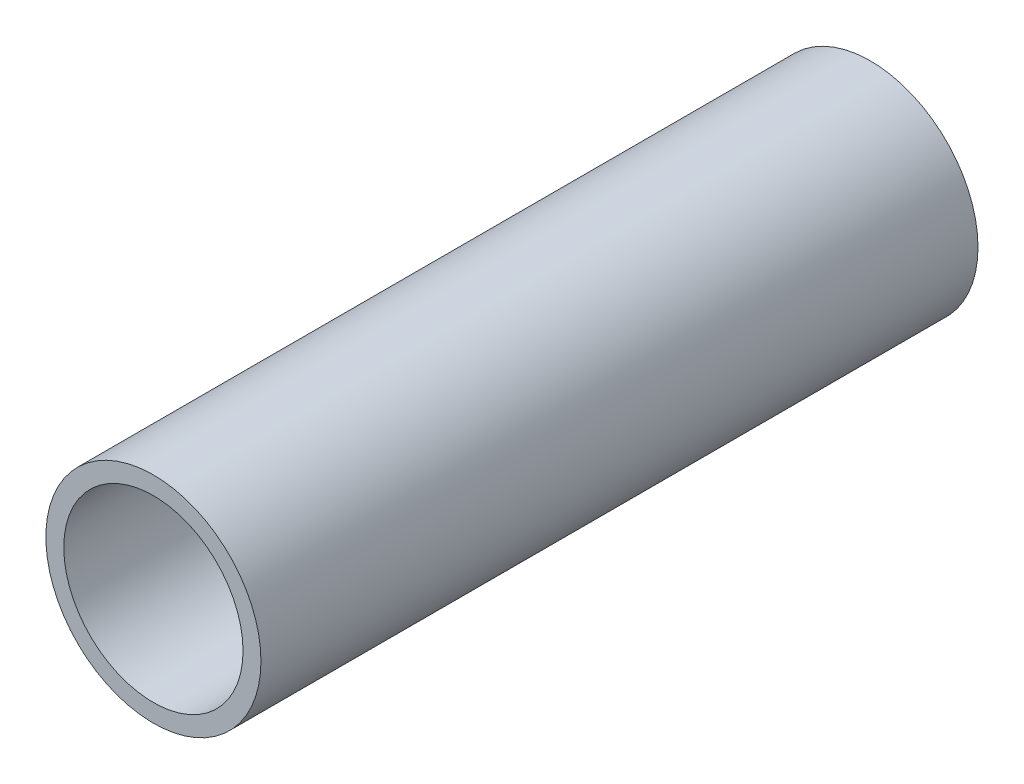
ISO-10303-21;
HEADER;
FILE_DESCRIPTION(('STEP AP214'),'2;1');
FILE_NAME('part.step','',(''),(''),'','','');
FILE_SCHEMA(('AUTOMOTIVE_DESIGN { 1 0 10303 214 1 1 1 1 }'));
ENDSEC;
DATA;
#1=APPLICATION_CONTEXT('core data for automotive mechanical design processes');
#2=APPLICATION_PROTOCOL_DEFINITION('international standard','automotive_design',2000,#1);
#3=PRODUCT_CONTEXT('',#1,'mechanical');
#4=PRODUCT('Part','Part','',(#3));
#5=PRODUCT_RELATED_PRODUCT_CATEGORY('part','',(#4));
#6=PRODUCT_DEFINITION_FORMATION('','',#4);
#7=PRODUCT_DEFINITION_CONTEXT('part definition',#1,'design');
#8=PRODUCT_DEFINITION('design','',#6,#7);
#9=PRODUCT_DEFINITION_SHAPE('','',#8);
#10=(LENGTH_UNIT() NAMED_UNIT(*) SI_UNIT(.MILLI.,.METRE.));
#11=(NAMED_UNIT(*) PLANE_ANGLE_UNIT() SI_UNIT($,.RADIAN.));
#12=(NAMED_UNIT(*) SI_UNIT($,.STERADIAN.) SOLID_ANGLE_UNIT());
#13=UNCERTAINTY_MEASURE_WITH_UNIT(LENGTH_MEASURE(1.E-05),#10,'distance_accuracy_value','');
#14=(GEOMETRIC_REPRESENTATION_CONTEXT(3) GLOBAL_UNCERTAINTY_ASSIGNED_CONTEXT((#13)) GLOBAL_UNIT_ASSIGNED_CONTEXT((#10,
#11,#12)) REPRESENTATION_CONTEXT('',''));
#15=CARTESIAN_POINT('',(0.,0.,0.));
#16=DIRECTION('',(0.,0.,1.));
#17=DIRECTION('',(1.,0.,0.));
#18=AXIS2_PLACEMENT_3D('',#15,#16,#17);
#19=CARTESIAN_POINT('',(0.,0.,100.));
#20=DIRECTION('',(0.,0.,1.));
#21=DIRECTION('',(1.,0.,0.));
#22=AXIS2_PLACEMENT_3D('',#19,#20,#21);
#23=PLANE('',#22);
#24=CARTESIAN_POINT('',(0.,0.,100.));
#25=DIRECTION('',(0.,0.,1.));
#26=DIRECTION('',(1.,0.,0.));
#27=AXIS2_PLACEMENT_3D('',#24,#25,#26);
#28=CIRCLE('',#27,15.);
#29=CARTESIAN_POINT('',(15.,0.,100.));
#30=VERTEX_POINT('',#29);
#31=EDGE_CURVE('E10',#30,#30,#28,.T.);
#32=ORIENTED_EDGE('',*,*,#31,.T.);
#33=EDGE_LOOP('',(#32));
#34=FACE_BOUND('',#33,.T.);
#35=CARTESIAN_POINT('',(0.,0.,100.));
#36=DIRECTION('',(0.,0.,1.));
#37=DIRECTION('',(1.,0.,0.));
#38=AXIS2_PLACEMENT_3D('',#35,#36,#37);
#39=CIRCLE('',#38,12.5);
#40=CARTESIAN_POINT('',(12.5,0.,100.));
#41=VERTEX_POINT('',#40);
#42=EDGE_CURVE('E50',#41,#41,#39,.T.);
#43=ORIENTED_EDGE('',*,*,#42,.F.);
#44=EDGE_LOOP('',(#43));
#45=FACE_BOUND('',#44,.T.);
#46=ADVANCED_FACE('F37',(#34,#45),#23,.T.);
#47=CARTESIAN_POINT('',(0.,0.,0.));
#48=DIRECTION('',(0.,0.,1.));
#49=DIRECTION('',(1.,0.,0.));
#50=AXIS2_PLACEMENT_3D('',#47,#48,#49);
#51=PLANE('',#50);
#52=CARTESIAN_POINT('',(0.,0.,0.));
#53=DIRECTION('',(0.,0.,1.));
#54=DIRECTION('',(1.,0.,0.));
#55=AXIS2_PLACEMENT_3D('',#52,#53,#54);
#56=CIRCLE('',#55,15.);
#57=CARTESIAN_POINT('',(15.,0.,0.));
#58=VERTEX_POINT('',#57);
#59=EDGE_CURVE('E41',#58,#58,#56,.T.);
#60=ORIENTED_EDGE('',*,*,#59,.F.);
#61=EDGE_LOOP('',(#60));
#62=FACE_BOUND('',#61,.T.);
#63=CARTESIAN_POINT('',(0.,0.,0.));
#64=DIRECTION('',(0.,0.,1.));
#65=DIRECTION('',(1.,0.,0.));
#66=AXIS2_PLACEMENT_3D('',#63,#64,#65);
#67=CIRCLE('',#66,12.5);
#68=CARTESIAN_POINT('',(12.5,0.,0.));
#69=VERTEX_POINT('',#68);
#70=EDGE_CURVE('E52',#69,#69,#67,.T.);
#71=ORIENTED_EDGE('',*,*,#70,.T.);
#72=EDGE_LOOP('',(#71));
#73=FACE_BOUND('',#72,.T.);
#74=ADVANCED_FACE('F64',(#62,#73),#51,.F.);
#75=CARTESIAN_POINT('',(0.,0.,100.));
#76=DIRECTION('',(0.,0.,-1.));
#77=DIRECTION('',(-1.,0.,0.));
#78=AXIS2_PLACEMENT_3D('',#75,#76,#77);
#79=CYLINDRICAL_SURFACE('',#78,15.);
#80=ORIENTED_EDGE('',*,*,#31,.F.);
#81=EDGE_LOOP('',(#80));
#82=FACE_BOUND('',#81,.T.);
#83=ORIENTED_EDGE('',*,*,#59,.T.);
#84=EDGE_LOOP('',(#83));
#85=FACE_BOUND('',#84,.T.);
#86=ADVANCED_FACE('F39',(#82,#85),#79,.T.);
#87=CARTESIAN_POINT('',(0.,0.,100.));
#88=DIRECTION('',(0.,0.,-1.));
#89=DIRECTION('',(-1.,0.,0.));
#90=AXIS2_PLACEMENT_3D('',#87,#88,#89);
#91=CYLINDRICAL_SURFACE('',#90,12.5);
#92=ORIENTED_EDGE('',*,*,#42,.T.);
#93=EDGE_LOOP('',(#92));
#94=FACE_BOUND('',#93,.T.);
#95=ORIENTED_EDGE('',*,*,#70,.F.);
#96=EDGE_LOOP('',(#95));
#97=FACE_BOUND('',#96,.T.);
#98=ADVANCED_FACE('F60',(#94,#97),#91,.F.);
#99=CLOSED_SHELL('',(#46,#74,#86,#98));
#100=MANIFOLD_SOLID_BREP('B2',#99);
#101=ADVANCED_BREP_SHAPE_REPRESENTATION('',(#18,#100),#14);
#102=SHAPE_DEFINITION_REPRESENTATION(#9,#101);
ENDSEC;
END-ISO-10303-21;
